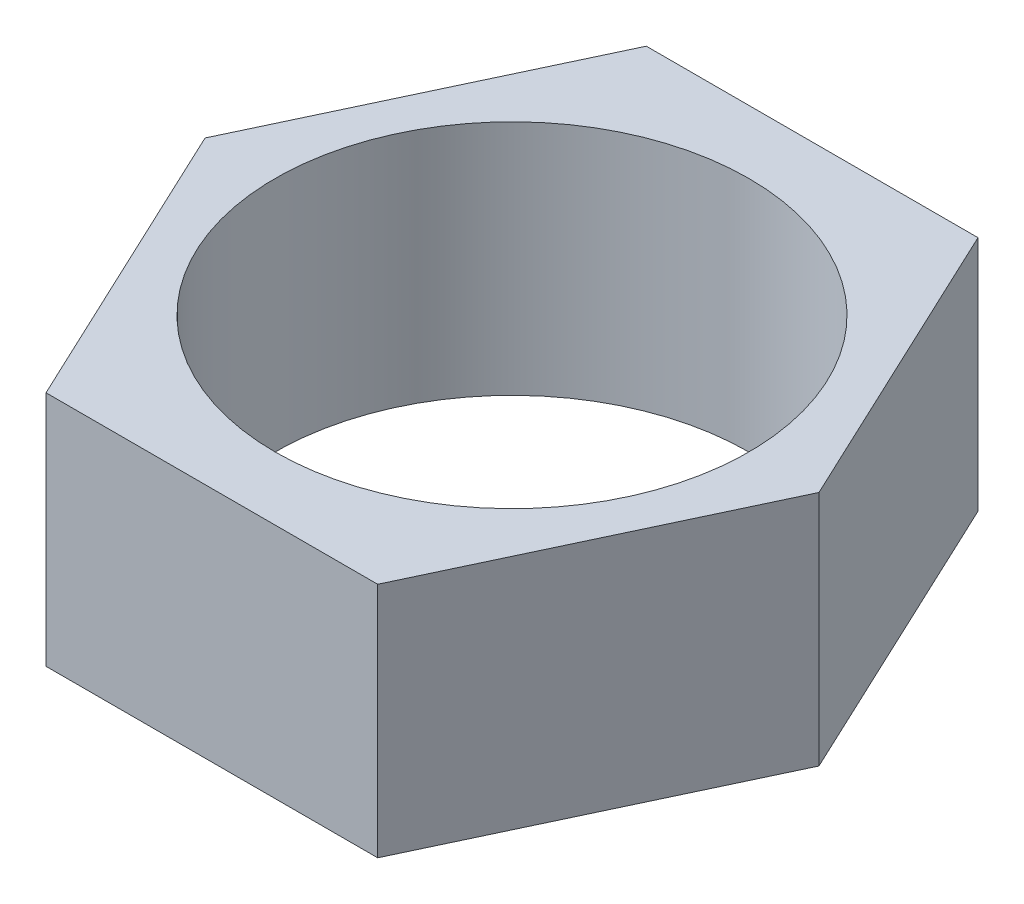
ISO-10303-21;
HEADER;
FILE_DESCRIPTION(('STEP AP214'),'2;1');
FILE_NAME('part.step','',(''),(''),'','','');
FILE_SCHEMA(('AUTOMOTIVE_DESIGN { 1 0 10303 214 1 1 1 1 }'));
ENDSEC;
DATA;
#1=APPLICATION_CONTEXT('core data for automotive mechanical design processes');
#2=APPLICATION_PROTOCOL_DEFINITION('international standard','automotive_design',2000,#1);
#3=PRODUCT_CONTEXT('',#1,'mechanical');
#4=PRODUCT('Part','Part','',(#3));
#5=PRODUCT_RELATED_PRODUCT_CATEGORY('part','',(#4));
#6=PRODUCT_DEFINITION_FORMATION('','',#4);
#7=PRODUCT_DEFINITION_CONTEXT('part definition',#1,'design');
#8=PRODUCT_DEFINITION('design','',#6,#7);
#9=PRODUCT_DEFINITION_SHAPE('','',#8);
#10=(LENGTH_UNIT() NAMED_UNIT(*) SI_UNIT(.MILLI.,.METRE.));
#11=(NAMED_UNIT(*) PLANE_ANGLE_UNIT() SI_UNIT($,.RADIAN.));
#12=(NAMED_UNIT(*) SI_UNIT($,.STERADIAN.) SOLID_ANGLE_UNIT());
#13=UNCERTAINTY_MEASURE_WITH_UNIT(LENGTH_MEASURE(1.E-05),#10,'distance_accuracy_value','');
#14=(GEOMETRIC_REPRESENTATION_CONTEXT(3) GLOBAL_UNCERTAINTY_ASSIGNED_CONTEXT((#13)) GLOBAL_UNIT_ASSIGNED_CONTEXT((#10,
#11,#12)) REPRESENTATION_CONTEXT('',''));
#15=CARTESIAN_POINT('',(0.,0.,0.));
#16=DIRECTION('',(0.,0.,1.));
#17=DIRECTION('',(1.,0.,0.));
#18=AXIS2_PLACEMENT_3D('',#15,#16,#17);
#19=CARTESIAN_POINT('',(5.30556060484488,5.,2.49443315574279));
#20=DIRECTION('',(0.904969872431708,0.,0.425475651466613));
#21=DIRECTION('',(0.425475651466613,0.,-0.904969872431708));
#22=AXIS2_PLACEMENT_3D('',#19,#20,#21);
#23=PLANE('',#22);
#24=DIRECTION('',(-0.425475651466613,0.,0.904969872431707));
#25=VECTOR('',#24,1.);
#26=CARTESIAN_POINT('',(5.30556060484488,0.,2.49443315574279));
#27=LINE('',#26,#25);
#28=CARTESIAN_POINT('',(6.47832956026629,0.,0.));
#29=VERTEX_POINT('',#28);
#30=CARTESIAN_POINT('',(3.5,0.,6.33478910702195));
#31=VERTEX_POINT('',#30);
#32=EDGE_CURVE('E124',#29,#31,#27,.T.);
#33=ORIENTED_EDGE('',*,*,#32,.F.);
#34=DIRECTION('',(0.,-1.,0.));
#35=VECTOR('',#34,1.);
#36=CARTESIAN_POINT('',(6.47832956026629,5.,0.));
#37=LINE('',#36,#35);
#38=CARTESIAN_POINT('',(6.47832956026629,5.,0.));
#39=VERTEX_POINT('',#38);
#40=EDGE_CURVE('E11',#39,#29,#37,.T.);
#41=ORIENTED_EDGE('',*,*,#40,.F.);
#42=DIRECTION('',(-0.425475651466613,0.,0.904969872431707));
#43=VECTOR('',#42,1.);
#44=CARTESIAN_POINT('',(5.30556060484488,5.,2.49443315574279));
#45=LINE('',#44,#43);
#46=CARTESIAN_POINT('',(3.5,5.,6.33478910702195));
#47=VERTEX_POINT('',#46);
#48=EDGE_CURVE('E139',#39,#47,#45,.T.);
#49=ORIENTED_EDGE('',*,*,#48,.T.);
#50=DIRECTION('',(0.,-1.,0.));
#51=VECTOR('',#50,1.);
#52=CARTESIAN_POINT('',(3.5,5.,6.33478910702195));
#53=LINE('',#52,#51);
#54=EDGE_CURVE('E59',#47,#31,#53,.T.);
#55=ORIENTED_EDGE('',*,*,#54,.T.);
#56=EDGE_LOOP('',(#33,#41,#49,#55));
#57=FACE_BOUND('',#56,.T.);
#58=ADVANCED_FACE('F43',(#57),#23,.T.);
#59=CARTESIAN_POINT('',(5.30556060484488,5.,-2.49443315574279));
#60=DIRECTION('',(0.904969872431707,0.,-0.425475651466614));
#61=DIRECTION('',(-0.425475651466614,0.,-0.904969872431707));
#62=AXIS2_PLACEMENT_3D('',#59,#60,#61);
#63=PLANE('',#62);
#64=DIRECTION('',(0.425475651466614,0.,0.904969872431707));
#65=VECTOR('',#64,1.);
#66=CARTESIAN_POINT('',(5.30556060484488,0.,-2.49443315574279));
#67=LINE('',#66,#65);
#68=CARTESIAN_POINT('',(3.5,0.,-6.33478910702195));
#69=VERTEX_POINT('',#68);
#70=EDGE_CURVE('E126',#69,#29,#67,.T.);
#71=ORIENTED_EDGE('',*,*,#70,.F.);
#72=DIRECTION('',(0.,-1.,0.));
#73=VECTOR('',#72,1.);
#74=CARTESIAN_POINT('',(3.5,5.,-6.33478910702195));
#75=LINE('',#74,#73);
#76=CARTESIAN_POINT('',(3.5,5.,-6.33478910702195));
#77=VERTEX_POINT('',#76);
#78=EDGE_CURVE('E51',#77,#69,#75,.T.);
#79=ORIENTED_EDGE('',*,*,#78,.F.);
#80=DIRECTION('',(0.425475651466614,0.,0.904969872431707));
#81=VECTOR('',#80,1.);
#82=CARTESIAN_POINT('',(5.30556060484488,5.,-2.49443315574279));
#83=LINE('',#82,#81);
#84=EDGE_CURVE('E262',#77,#39,#83,.T.);
#85=ORIENTED_EDGE('',*,*,#84,.T.);
#86=ORIENTED_EDGE('',*,*,#40,.T.);
#87=EDGE_LOOP('',(#71,#79,#85,#86));
#88=FACE_BOUND('',#87,.T.);
#89=ADVANCED_FACE('F148',(#88),#63,.T.);
#90=CARTESIAN_POINT('',(0.,5.,-6.33478910702195));
#91=DIRECTION('',(0.,0.,-1.));
#92=DIRECTION('',(-1.,0.,0.));
#93=AXIS2_PLACEMENT_3D('',#90,#91,#92);
#94=PLANE('',#93);
#95=DIRECTION('',(1.,0.,0.));
#96=VECTOR('',#95,1.);
#97=CARTESIAN_POINT('',(0.,0.,-6.33478910702195));
#98=LINE('',#97,#96);
#99=CARTESIAN_POINT('',(-3.5,0.,-6.33478910702195));
#100=VERTEX_POINT('',#99);
#101=EDGE_CURVE('E130',#100,#69,#98,.T.);
#102=ORIENTED_EDGE('',*,*,#101,.F.);
#103=DIRECTION('',(0.,-1.,0.));
#104=VECTOR('',#103,1.);
#105=CARTESIAN_POINT('',(-3.5,5.,-6.33478910702195));
#106=LINE('',#105,#104);
#107=CARTESIAN_POINT('',(-3.5,5.,-6.33478910702195));
#108=VERTEX_POINT('',#107);
#109=EDGE_CURVE('E106',#108,#100,#106,.T.);
#110=ORIENTED_EDGE('',*,*,#109,.F.);
#111=DIRECTION('',(1.,0.,0.));
#112=VECTOR('',#111,1.);
#113=CARTESIAN_POINT('',(0.,5.,-6.33478910702195));
#114=LINE('',#113,#112);
#115=EDGE_CURVE('E116',#108,#77,#114,.T.);
#116=ORIENTED_EDGE('',*,*,#115,.T.);
#117=ORIENTED_EDGE('',*,*,#78,.T.);
#118=EDGE_LOOP('',(#102,#110,#116,#117));
#119=FACE_BOUND('',#118,.T.);
#120=ADVANCED_FACE('F145',(#119),#94,.T.);
#121=CARTESIAN_POINT('',(-5.30556060484488,5.,-2.49443315574279));
#122=DIRECTION('',(-0.904969872431708,0.,-0.425475651466613));
#123=DIRECTION('',(-0.425475651466613,0.,0.904969872431708));
#124=AXIS2_PLACEMENT_3D('',#121,#122,#123);
#125=PLANE('',#124);
#126=DIRECTION('',(0.425475651466613,0.,-0.904969872431708));
#127=VECTOR('',#126,1.);
#128=CARTESIAN_POINT('',(-5.30556060484488,0.,-2.49443315574279));
#129=LINE('',#128,#127);
#130=CARTESIAN_POINT('',(-6.47832956026629,0.,0.));
#131=VERTEX_POINT('',#130);
#132=EDGE_CURVE('E102',#131,#100,#129,.T.);
#133=ORIENTED_EDGE('',*,*,#132,.F.);
#134=DIRECTION('',(0.,-1.,0.));
#135=VECTOR('',#134,1.);
#136=CARTESIAN_POINT('',(-6.47832956026629,5.,0.));
#137=LINE('',#136,#135);
#138=CARTESIAN_POINT('',(-6.47832956026629,5.,0.));
#139=VERTEX_POINT('',#138);
#140=EDGE_CURVE('E97',#139,#131,#137,.T.);
#141=ORIENTED_EDGE('',*,*,#140,.F.);
#142=DIRECTION('',(0.425475651466613,0.,-0.904969872431708));
#143=VECTOR('',#142,1.);
#144=CARTESIAN_POINT('',(-5.30556060484488,5.,-2.49443315574279));
#145=LINE('',#144,#143);
#146=EDGE_CURVE('E100',#139,#108,#145,.T.);
#147=ORIENTED_EDGE('',*,*,#146,.T.);
#148=ORIENTED_EDGE('',*,*,#109,.T.);
#149=EDGE_LOOP('',(#133,#141,#147,#148));
#150=FACE_BOUND('',#149,.T.);
#151=ADVANCED_FACE('F99',(#150),#125,.T.);
#152=CARTESIAN_POINT('',(-5.30556060484488,5.,2.49443315574279));
#153=DIRECTION('',(-0.904969872431707,0.,0.425475651466614));
#154=DIRECTION('',(0.425475651466614,0.,0.904969872431707));
#155=AXIS2_PLACEMENT_3D('',#152,#153,#154);
#156=PLANE('',#155);
#157=DIRECTION('',(-0.425475651466614,0.,-0.904969872431707));
#158=VECTOR('',#157,1.);
#159=CARTESIAN_POINT('',(-5.30556060484488,0.,2.49443315574279));
#160=LINE('',#159,#158);
#161=CARTESIAN_POINT('',(-3.5,0.,6.33478910702195));
#162=VERTEX_POINT('',#161);
#163=EDGE_CURVE('E134',#162,#131,#160,.T.);
#164=ORIENTED_EDGE('',*,*,#163,.F.);
#165=DIRECTION('',(0.,-1.,0.));
#166=VECTOR('',#165,1.);
#167=CARTESIAN_POINT('',(-3.5,5.,6.33478910702195));
#168=LINE('',#167,#166);
#169=CARTESIAN_POINT('',(-3.5,5.,6.33478910702195));
#170=VERTEX_POINT('',#169);
#171=EDGE_CURVE('E78',#170,#162,#168,.T.);
#172=ORIENTED_EDGE('',*,*,#171,.F.);
#173=DIRECTION('',(-0.425475651466614,0.,-0.904969872431707));
#174=VECTOR('',#173,1.);
#175=CARTESIAN_POINT('',(-5.30556060484488,5.,2.49443315574279));
#176=LINE('',#175,#174);
#177=EDGE_CURVE('E113',#170,#139,#176,.T.);
#178=ORIENTED_EDGE('',*,*,#177,.T.);
#179=ORIENTED_EDGE('',*,*,#140,.T.);
#180=EDGE_LOOP('',(#164,#172,#178,#179));
#181=FACE_BOUND('',#180,.T.);
#182=ADVANCED_FACE('F118',(#181),#156,.T.);
#183=CARTESIAN_POINT('',(0.,5.,6.33478910702195));
#184=DIRECTION('',(0.,0.,1.));
#185=DIRECTION('',(1.,0.,0.));
#186=AXIS2_PLACEMENT_3D('',#183,#184,#185);
#187=PLANE('',#186);
#188=DIRECTION('',(-1.,0.,0.));
#189=VECTOR('',#188,1.);
#190=CARTESIAN_POINT('',(0.,0.,6.33478910702195));
#191=LINE('',#190,#189);
#192=EDGE_CURVE('E136',#31,#162,#191,.T.);
#193=ORIENTED_EDGE('',*,*,#192,.F.);
#194=ORIENTED_EDGE('',*,*,#54,.F.);
#195=DIRECTION('',(-1.,0.,0.));
#196=VECTOR('',#195,1.);
#197=CARTESIAN_POINT('',(0.,5.,6.33478910702195));
#198=LINE('',#197,#196);
#199=EDGE_CURVE('E119',#47,#170,#198,.T.);
#200=ORIENTED_EDGE('',*,*,#199,.T.);
#201=ORIENTED_EDGE('',*,*,#171,.T.);
#202=EDGE_LOOP('',(#193,#194,#200,#201));
#203=FACE_BOUND('',#202,.T.);
#204=ADVANCED_FACE('F151',(#203),#187,.T.);
#205=CARTESIAN_POINT('',(0.,5.,0.));
#206=DIRECTION('',(0.,1.,0.));
#207=DIRECTION('',(0.,0.,1.));
#208=AXIS2_PLACEMENT_3D('',#205,#206,#207);
#209=PLANE('',#208);
#210=CARTESIAN_POINT('',(0.,5.,0.));
#211=DIRECTION('',(0.,1.,0.));
#212=DIRECTION('',(0.,0.,1.));
#213=AXIS2_PLACEMENT_3D('',#210,#211,#212);
#214=CIRCLE('',#213,5.);
#215=CARTESIAN_POINT('',(0.,5.,5.));
#216=VERTEX_POINT('',#215);
#217=EDGE_CURVE('E255',#216,#216,#214,.T.);
#218=ORIENTED_EDGE('',*,*,#217,.F.);
#219=EDGE_LOOP('',(#218));
#220=FACE_BOUND('',#219,.T.);
#221=ORIENTED_EDGE('',*,*,#48,.F.);
#222=ORIENTED_EDGE('',*,*,#84,.F.);
#223=ORIENTED_EDGE('',*,*,#115,.F.);
#224=ORIENTED_EDGE('',*,*,#146,.F.);
#225=ORIENTED_EDGE('',*,*,#177,.F.);
#226=ORIENTED_EDGE('',*,*,#199,.F.);
#227=EDGE_LOOP('',(#221,#222,#223,#224,#225,#226));
#228=FACE_BOUND('',#227,.T.);
#229=ADVANCED_FACE('F111',(#220,#228),#209,.T.);
#230=CARTESIAN_POINT('',(0.,0.,0.));
#231=DIRECTION('',(0.,1.,0.));
#232=DIRECTION('',(0.,0.,1.));
#233=AXIS2_PLACEMENT_3D('',#230,#231,#232);
#234=PLANE('',#233);
#235=CARTESIAN_POINT('',(0.,0.,0.));
#236=DIRECTION('',(0.,1.,0.));
#237=DIRECTION('',(0.,0.,1.));
#238=AXIS2_PLACEMENT_3D('',#235,#236,#237);
#239=CIRCLE('',#238,5.);
#240=CARTESIAN_POINT('',(0.,0.,5.));
#241=VERTEX_POINT('',#240);
#242=EDGE_CURVE('E127',#241,#241,#239,.F.);
#243=ORIENTED_EDGE('',*,*,#242,.F.);
#244=EDGE_LOOP('',(#243));
#245=FACE_BOUND('',#244,.T.);
#246=ORIENTED_EDGE('',*,*,#32,.T.);
#247=ORIENTED_EDGE('',*,*,#192,.T.);
#248=ORIENTED_EDGE('',*,*,#163,.T.);
#249=ORIENTED_EDGE('',*,*,#132,.T.);
#250=ORIENTED_EDGE('',*,*,#101,.T.);
#251=ORIENTED_EDGE('',*,*,#70,.T.);
#252=EDGE_LOOP('',(#246,#247,#248,#249,#250,#251));
#253=FACE_BOUND('',#252,.T.);
#254=ADVANCED_FACE('F150',(#245,#253),#234,.F.);
#255=CARTESIAN_POINT('',(0.,-0.00100000000000013,0.));
#256=DIRECTION('',(0.,1.,0.));
#257=DIRECTION('',(0.,0.,1.));
#258=AXIS2_PLACEMENT_3D('',#255,#256,#257);
#259=CYLINDRICAL_SURFACE('',#258,5.);
#260=ORIENTED_EDGE('',*,*,#217,.T.);
#261=EDGE_LOOP('',(#260));
#262=FACE_BOUND('',#261,.T.);
#263=ORIENTED_EDGE('',*,*,#242,.T.);
#264=EDGE_LOOP('',(#263));
#265=FACE_BOUND('',#264,.T.);
#266=ADVANCED_FACE('F203',(#262,#265),#259,.F.);
#267=CLOSED_SHELL('',(#58,#89,#120,#151,#182,#204,#229,#254,#266));
#268=MANIFOLD_SOLID_BREP('B2',#267);
#269=ADVANCED_BREP_SHAPE_REPRESENTATION('',(#18,#268),#14);
#270=SHAPE_DEFINITION_REPRESENTATION(#9,#269);
ENDSEC;
END-ISO-10303-21;
